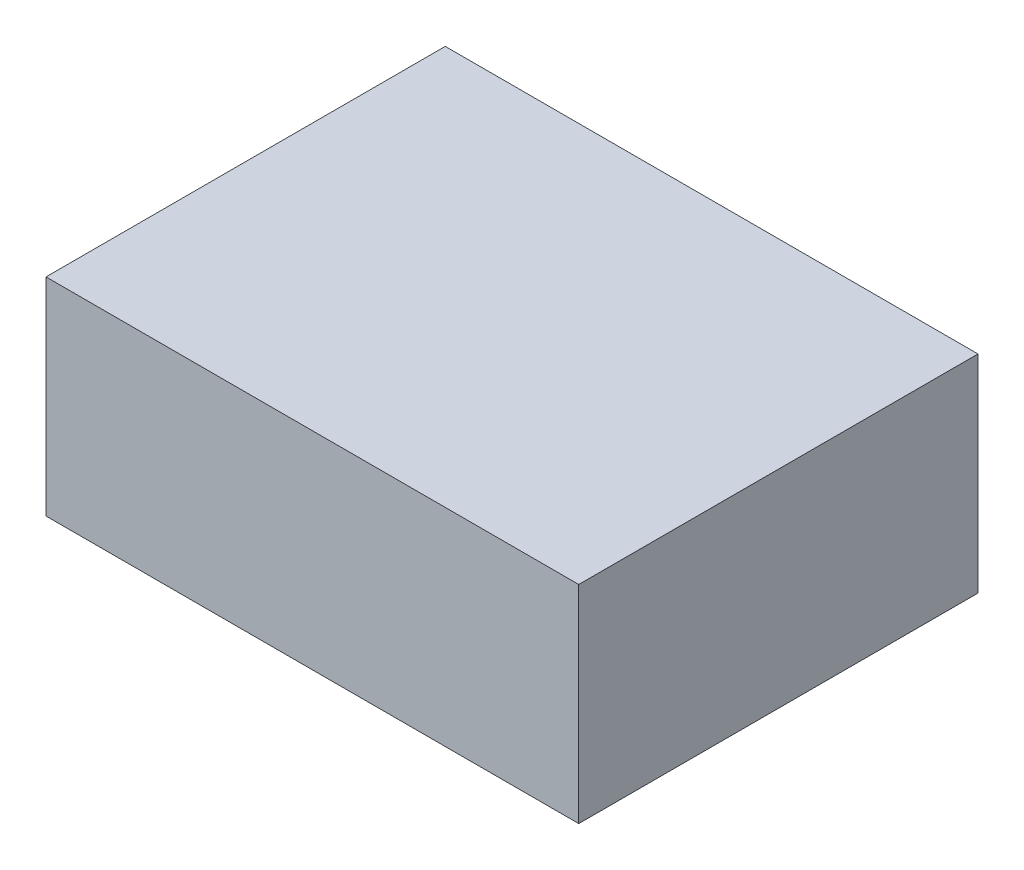
ISO-10303-21;
HEADER;
FILE_DESCRIPTION(('STEP AP214'),'2;1');
FILE_NAME('part.step','',(''),(''),'','','');
FILE_SCHEMA(('AUTOMOTIVE_DESIGN { 1 0 10303 214 1 1 1 1 }'));
ENDSEC;
DATA;
#1=APPLICATION_CONTEXT('core data for automotive mechanical design processes');
#2=APPLICATION_PROTOCOL_DEFINITION('international standard','automotive_design',2000,#1);
#3=PRODUCT_CONTEXT('',#1,'mechanical');
#4=PRODUCT('Part','Part','',(#3));
#5=PRODUCT_RELATED_PRODUCT_CATEGORY('part','',(#4));
#6=PRODUCT_DEFINITION_FORMATION('','',#4);
#7=PRODUCT_DEFINITION_CONTEXT('part definition',#1,'design');
#8=PRODUCT_DEFINITION('design','',#6,#7);
#9=PRODUCT_DEFINITION_SHAPE('','',#8);
#10=(LENGTH_UNIT() NAMED_UNIT(*) SI_UNIT(.MILLI.,.METRE.));
#11=(NAMED_UNIT(*) PLANE_ANGLE_UNIT() SI_UNIT($,.RADIAN.));
#12=(NAMED_UNIT(*) SI_UNIT($,.STERADIAN.) SOLID_ANGLE_UNIT());
#13=UNCERTAINTY_MEASURE_WITH_UNIT(LENGTH_MEASURE(1.E-05),#10,'distance_accuracy_value','');
#14=(GEOMETRIC_REPRESENTATION_CONTEXT(3) GLOBAL_UNCERTAINTY_ASSIGNED_CONTEXT((#13)) GLOBAL_UNIT_ASSIGNED_CONTEXT((#10,
#11,#12)) REPRESENTATION_CONTEXT('',''));
#15=CARTESIAN_POINT('',(0.,0.,0.));
#16=DIRECTION('',(0.,0.,1.));
#17=DIRECTION('',(1.,0.,0.));
#18=AXIS2_PLACEMENT_3D('',#15,#16,#17);
#19=CARTESIAN_POINT('',(23.15,-9.,34.7));
#20=DIRECTION('',(-1.,0.,0.));
#21=DIRECTION('',(0.,0.,1.));
#22=AXIS2_PLACEMENT_3D('',#19,#20,#21);
#23=PLANE('',#22);
#24=DIRECTION('',(0.,1.,0.));
#25=VECTOR('',#24,1.);
#26=CARTESIAN_POINT('',(23.15,-9.,0.));
#27=LINE('',#26,#25);
#28=CARTESIAN_POINT('',(23.15,-9.,0.));
#29=VERTEX_POINT('',#28);
#30=CARTESIAN_POINT('',(23.15,9.,0.));
#31=VERTEX_POINT('',#30);
#32=EDGE_CURVE('E102',#29,#31,#27,.T.);
#33=ORIENTED_EDGE('',*,*,#32,.T.);
#34=DIRECTION('',(0.,0.,-1.));
#35=VECTOR('',#34,1.);
#36=CARTESIAN_POINT('',(23.15,9.,34.7));
#37=LINE('',#36,#35);
#38=CARTESIAN_POINT('',(23.15,9.,34.7));
#39=VERTEX_POINT('',#38);
#40=EDGE_CURVE('E11',#39,#31,#37,.T.);
#41=ORIENTED_EDGE('',*,*,#40,.F.);
#42=DIRECTION('',(0.,1.,0.));
#43=VECTOR('',#42,1.);
#44=CARTESIAN_POINT('',(23.15,-9.,34.7));
#45=LINE('',#44,#43);
#46=CARTESIAN_POINT('',(23.15,-9.,34.7));
#47=VERTEX_POINT('',#46);
#48=EDGE_CURVE('E90',#47,#39,#45,.T.);
#49=ORIENTED_EDGE('',*,*,#48,.F.);
#50=DIRECTION('',(0.,0.,-1.));
#51=VECTOR('',#50,1.);
#52=CARTESIAN_POINT('',(23.15,-9.,34.7));
#53=LINE('',#52,#51);
#54=EDGE_CURVE('E98',#47,#29,#53,.T.);
#55=ORIENTED_EDGE('',*,*,#54,.T.);
#56=EDGE_LOOP('',(#33,#41,#49,#55));
#57=FACE_BOUND('',#56,.T.);
#58=ADVANCED_FACE('F39',(#57),#23,.F.);
#59=CARTESIAN_POINT('',(-23.15,9.,34.7));
#60=DIRECTION('',(0.,-1.,0.));
#61=DIRECTION('',(0.,0.,-1.));
#62=AXIS2_PLACEMENT_3D('',#59,#60,#61);
#63=PLANE('',#62);
#64=DIRECTION('',(-1.,0.,0.));
#65=VECTOR('',#64,1.);
#66=CARTESIAN_POINT('',(-23.15,9.,0.));
#67=LINE('',#66,#65);
#68=CARTESIAN_POINT('',(-23.15,9.,0.));
#69=VERTEX_POINT('',#68);
#70=EDGE_CURVE('E94',#31,#69,#67,.T.);
#71=ORIENTED_EDGE('',*,*,#70,.T.);
#72=DIRECTION('',(0.,0.,-1.));
#73=VECTOR('',#72,1.);
#74=CARTESIAN_POINT('',(-23.15,9.,34.7));
#75=LINE('',#74,#73);
#76=CARTESIAN_POINT('',(-23.15,9.,34.7));
#77=VERTEX_POINT('',#76);
#78=EDGE_CURVE('E47',#77,#69,#75,.T.);
#79=ORIENTED_EDGE('',*,*,#78,.F.);
#80=DIRECTION('',(-1.,0.,0.));
#81=VECTOR('',#80,1.);
#82=CARTESIAN_POINT('',(-23.15,9.,34.7));
#83=LINE('',#82,#81);
#84=EDGE_CURVE('E85',#39,#77,#83,.T.);
#85=ORIENTED_EDGE('',*,*,#84,.F.);
#86=ORIENTED_EDGE('',*,*,#40,.T.);
#87=EDGE_LOOP('',(#71,#79,#85,#86));
#88=FACE_BOUND('',#87,.T.);
#89=ADVANCED_FACE('F93',(#88),#63,.F.);
#90=CARTESIAN_POINT('',(-23.15,-9.,34.7));
#91=DIRECTION('',(1.,0.,0.));
#92=DIRECTION('',(0.,0.,-1.));
#93=AXIS2_PLACEMENT_3D('',#90,#91,#92);
#94=PLANE('',#93);
#95=DIRECTION('',(0.,-1.,0.));
#96=VECTOR('',#95,1.);
#97=CARTESIAN_POINT('',(-23.15,-9.,0.));
#98=LINE('',#97,#96);
#99=CARTESIAN_POINT('',(-23.15,-9.,0.));
#100=VERTEX_POINT('',#99);
#101=EDGE_CURVE('E72',#69,#100,#98,.T.);
#102=ORIENTED_EDGE('',*,*,#101,.T.);
#103=DIRECTION('',(0.,0.,-1.));
#104=VECTOR('',#103,1.);
#105=CARTESIAN_POINT('',(-23.15,-9.,34.7));
#106=LINE('',#105,#104);
#107=CARTESIAN_POINT('',(-23.15,-9.,34.7));
#108=VERTEX_POINT('',#107);
#109=EDGE_CURVE('E95',#108,#100,#106,.T.);
#110=ORIENTED_EDGE('',*,*,#109,.F.);
#111=DIRECTION('',(0.,-1.,0.));
#112=VECTOR('',#111,1.);
#113=CARTESIAN_POINT('',(-23.15,-9.,34.7));
#114=LINE('',#113,#112);
#115=EDGE_CURVE('E88',#77,#108,#114,.T.);
#116=ORIENTED_EDGE('',*,*,#115,.F.);
#117=ORIENTED_EDGE('',*,*,#78,.T.);
#118=EDGE_LOOP('',(#102,#110,#116,#117));
#119=FACE_BOUND('',#118,.T.);
#120=ADVANCED_FACE('F96',(#119),#94,.F.);
#121=CARTESIAN_POINT('',(-23.15,-9.,34.7));
#122=DIRECTION('',(0.,1.,0.));
#123=DIRECTION('',(0.,0.,1.));
#124=AXIS2_PLACEMENT_3D('',#121,#122,#123);
#125=PLANE('',#124);
#126=DIRECTION('',(1.,0.,0.));
#127=VECTOR('',#126,1.);
#128=CARTESIAN_POINT('',(-23.15,-9.,0.));
#129=LINE('',#128,#127);
#130=EDGE_CURVE('E78',#100,#29,#129,.T.);
#131=ORIENTED_EDGE('',*,*,#130,.T.);
#132=ORIENTED_EDGE('',*,*,#54,.F.);
#133=DIRECTION('',(1.,0.,0.));
#134=VECTOR('',#133,1.);
#135=CARTESIAN_POINT('',(-23.15,-9.,34.7));
#136=LINE('',#135,#134);
#137=EDGE_CURVE('E55',#108,#47,#136,.T.);
#138=ORIENTED_EDGE('',*,*,#137,.F.);
#139=ORIENTED_EDGE('',*,*,#109,.T.);
#140=EDGE_LOOP('',(#131,#132,#138,#139));
#141=FACE_BOUND('',#140,.T.);
#142=ADVANCED_FACE('F109',(#141),#125,.F.);
#143=CARTESIAN_POINT('',(0.,0.,34.7));
#144=DIRECTION('',(0.,0.,-1.));
#145=DIRECTION('',(-1.,0.,0.));
#146=AXIS2_PLACEMENT_3D('',#143,#144,#145);
#147=PLANE('',#146);
#148=ORIENTED_EDGE('',*,*,#48,.T.);
#149=ORIENTED_EDGE('',*,*,#84,.T.);
#150=ORIENTED_EDGE('',*,*,#115,.T.);
#151=ORIENTED_EDGE('',*,*,#137,.T.);
#152=EDGE_LOOP('',(#148,#149,#150,#151));
#153=FACE_BOUND('',#152,.T.);
#154=ADVANCED_FACE('F86',(#153),#147,.F.);
#155=CARTESIAN_POINT('',(0.,0.,0.));
#156=DIRECTION('',(0.,0.,-1.));
#157=DIRECTION('',(-1.,0.,0.));
#158=AXIS2_PLACEMENT_3D('',#155,#156,#157);
#159=PLANE('',#158);
#160=ORIENTED_EDGE('',*,*,#32,.F.);
#161=ORIENTED_EDGE('',*,*,#130,.F.);
#162=ORIENTED_EDGE('',*,*,#101,.F.);
#163=ORIENTED_EDGE('',*,*,#70,.F.);
#164=EDGE_LOOP('',(#160,#161,#162,#163));
#165=FACE_BOUND('',#164,.T.);
#166=ADVANCED_FACE('F112',(#165),#159,.T.);
#167=CLOSED_SHELL('',(#58,#89,#120,#142,#154,#166));
#168=MANIFOLD_SOLID_BREP('B2',#167);
#169=ADVANCED_BREP_SHAPE_REPRESENTATION('',(#18,#168),#14);
#170=SHAPE_DEFINITION_REPRESENTATION(#9,#169);
ENDSEC;
END-ISO-10303-21;
